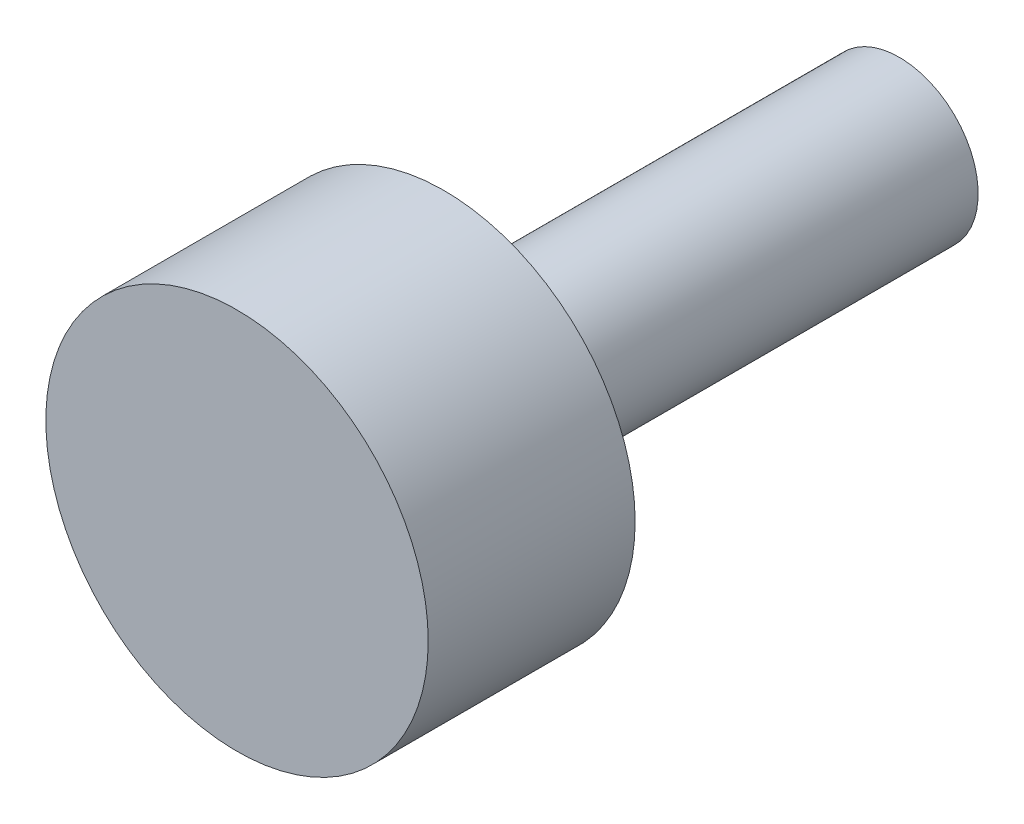
ISO-10303-21;
HEADER;
FILE_DESCRIPTION(('STEP AP214'),'2;1');
FILE_NAME('part.step','',(''),(''),'','','');
FILE_SCHEMA(('AUTOMOTIVE_DESIGN { 1 0 10303 214 1 1 1 1 }'));
ENDSEC;
DATA;
#1=APPLICATION_CONTEXT('core data for automotive mechanical design processes');
#2=APPLICATION_PROTOCOL_DEFINITION('international standard','automotive_design',2000,#1);
#3=PRODUCT_CONTEXT('',#1,'mechanical');
#4=PRODUCT('Part','Part','',(#3));
#5=PRODUCT_RELATED_PRODUCT_CATEGORY('part','',(#4));
#6=PRODUCT_DEFINITION_FORMATION('','',#4);
#7=PRODUCT_DEFINITION_CONTEXT('part definition',#1,'design');
#8=PRODUCT_DEFINITION('design','',#6,#7);
#9=PRODUCT_DEFINITION_SHAPE('','',#8);
#10=(LENGTH_UNIT() NAMED_UNIT(*) SI_UNIT(.MILLI.,.METRE.));
#11=(NAMED_UNIT(*) PLANE_ANGLE_UNIT() SI_UNIT($,.RADIAN.));
#12=(NAMED_UNIT(*) SI_UNIT($,.STERADIAN.) SOLID_ANGLE_UNIT());
#13=UNCERTAINTY_MEASURE_WITH_UNIT(LENGTH_MEASURE(1.E-05),#10,'distance_accuracy_value','');
#14=(GEOMETRIC_REPRESENTATION_CONTEXT(3) GLOBAL_UNCERTAINTY_ASSIGNED_CONTEXT((#13)) GLOBAL_UNIT_ASSIGNED_CONTEXT((#10,
#11,#12)) REPRESENTATION_CONTEXT('',''));
#15=CARTESIAN_POINT('',(0.,0.,0.));
#16=DIRECTION('',(0.,0.,1.));
#17=DIRECTION('',(1.,0.,0.));
#18=AXIS2_PLACEMENT_3D('',#15,#16,#17);
#19=CARTESIAN_POINT('',(-43.1655198451616,-81.7074440446685,9.2));
#20=DIRECTION('',(0.,0.,-1.));
#21=DIRECTION('',(-1.,0.,0.));
#22=AXIS2_PLACEMENT_3D('',#19,#20,#21);
#23=CYLINDRICAL_SURFACE('',#22,8.49999999999999);
#24=CARTESIAN_POINT('',(-43.1655198451616,-81.7074440446685,9.2));
#25=DIRECTION('',(0.,0.,1.));
#26=DIRECTION('',(1.,0.,0.));
#27=AXIS2_PLACEMENT_3D('',#24,#25,#26);
#28=CIRCLE('',#27,8.49999999999999);
#29=CARTESIAN_POINT('',(-34.6655198451616,-81.7074440446685,9.2));
#30=VERTEX_POINT('',#29);
#31=EDGE_CURVE('E37',#30,#30,#28,.T.);
#32=ORIENTED_EDGE('',*,*,#31,.F.);
#33=EDGE_LOOP('',(#32));
#34=FACE_BOUND('',#33,.T.);
#35=CARTESIAN_POINT('',(-43.1655198451616,-81.7074440446685,0.));
#36=DIRECTION('',(0.,0.,1.));
#37=DIRECTION('',(1.,0.,0.));
#38=AXIS2_PLACEMENT_3D('',#35,#36,#37);
#39=CIRCLE('',#38,8.49999999999999);
#40=CARTESIAN_POINT('',(-34.6655198451616,-81.7074440446685,0.));
#41=VERTEX_POINT('',#40);
#42=EDGE_CURVE('E33',#41,#41,#39,.T.);
#43=ORIENTED_EDGE('',*,*,#42,.T.);
#44=EDGE_LOOP('',(#43));
#45=FACE_BOUND('',#44,.T.);
#46=ADVANCED_FACE('F30',(#34,#45),#23,.T.);
#47=CARTESIAN_POINT('',(-43.1655198451616,-81.7074440446685,9.2));
#48=DIRECTION('',(0.,0.,1.));
#49=DIRECTION('',(1.,0.,0.));
#50=AXIS2_PLACEMENT_3D('',#47,#48,#49);
#51=PLANE('',#50);
#52=ORIENTED_EDGE('',*,*,#31,.T.);
#53=EDGE_LOOP('',(#52));
#54=FACE_BOUND('',#53,.T.);
#55=ADVANCED_FACE('F54',(#54),#51,.T.);
#56=CARTESIAN_POINT('',(-43.1655198451616,-81.7074440446685,0.));
#57=DIRECTION('',(0.,0.,1.));
#58=DIRECTION('',(1.,0.,0.));
#59=AXIS2_PLACEMENT_3D('',#56,#57,#58);
#60=PLANE('',#59);
#61=CARTESIAN_POINT('',(-43.1655198451616,-81.7074440446685,0.));
#62=DIRECTION('',(0.,0.,-1.));
#63=DIRECTION('',(-1.,0.,0.));
#64=AXIS2_PLACEMENT_3D('',#61,#62,#63);
#65=CIRCLE('',#64,3.5);
#66=CARTESIAN_POINT('',(-46.6655198451616,-81.7074440446685,0.));
#67=VERTEX_POINT('',#66);
#68=EDGE_CURVE('E10',#67,#67,#65,.T.);
#69=ORIENTED_EDGE('',*,*,#68,.F.);
#70=EDGE_LOOP('',(#69));
#71=FACE_BOUND('',#70,.T.);
#72=ORIENTED_EDGE('',*,*,#42,.F.);
#73=EDGE_LOOP('',(#72));
#74=FACE_BOUND('',#73,.T.);
#75=ADVANCED_FACE('F51',(#71,#74),#60,.F.);
#76=CARTESIAN_POINT('',(-43.1655198451616,-81.7074440446685,-20.25));
#77=DIRECTION('',(0.,0.,1.));
#78=DIRECTION('',(1.,0.,0.));
#79=AXIS2_PLACEMENT_3D('',#76,#77,#78);
#80=CYLINDRICAL_SURFACE('',#79,3.5);
#81=CARTESIAN_POINT('',(-43.1655198451616,-81.7074440446685,-20.25));
#82=DIRECTION('',(0.,0.,-1.));
#83=DIRECTION('',(-1.,0.,0.));
#84=AXIS2_PLACEMENT_3D('',#81,#82,#83);
#85=CIRCLE('',#84,3.5);
#86=CARTESIAN_POINT('',(-46.6655198451616,-81.7074440446685,-20.25));
#87=VERTEX_POINT('',#86);
#88=EDGE_CURVE('E43',#87,#87,#85,.T.);
#89=ORIENTED_EDGE('',*,*,#88,.F.);
#90=EDGE_LOOP('',(#89));
#91=FACE_BOUND('',#90,.T.);
#92=ORIENTED_EDGE('',*,*,#68,.T.);
#93=EDGE_LOOP('',(#92));
#94=FACE_BOUND('',#93,.T.);
#95=ADVANCED_FACE('F53',(#91,#94),#80,.T.);
#96=CARTESIAN_POINT('',(-43.1655198451616,-81.7074440446685,-20.25));
#97=DIRECTION('',(0.,0.,-1.));
#98=DIRECTION('',(-1.,0.,0.));
#99=AXIS2_PLACEMENT_3D('',#96,#97,#98);
#100=PLANE('',#99);
#101=ORIENTED_EDGE('',*,*,#88,.T.);
#102=EDGE_LOOP('',(#101));
#103=FACE_BOUND('',#102,.T.);
#104=ADVANCED_FACE('F60',(#103),#100,.T.);
#105=CLOSED_SHELL('',(#46,#55,#75,#95,#104));
#106=MANIFOLD_SOLID_BREP('B2',#105);
#107=ADVANCED_BREP_SHAPE_REPRESENTATION('',(#18,#106),#14);
#108=SHAPE_DEFINITION_REPRESENTATION(#9,#107);
ENDSEC;
END-ISO-10303-21;
